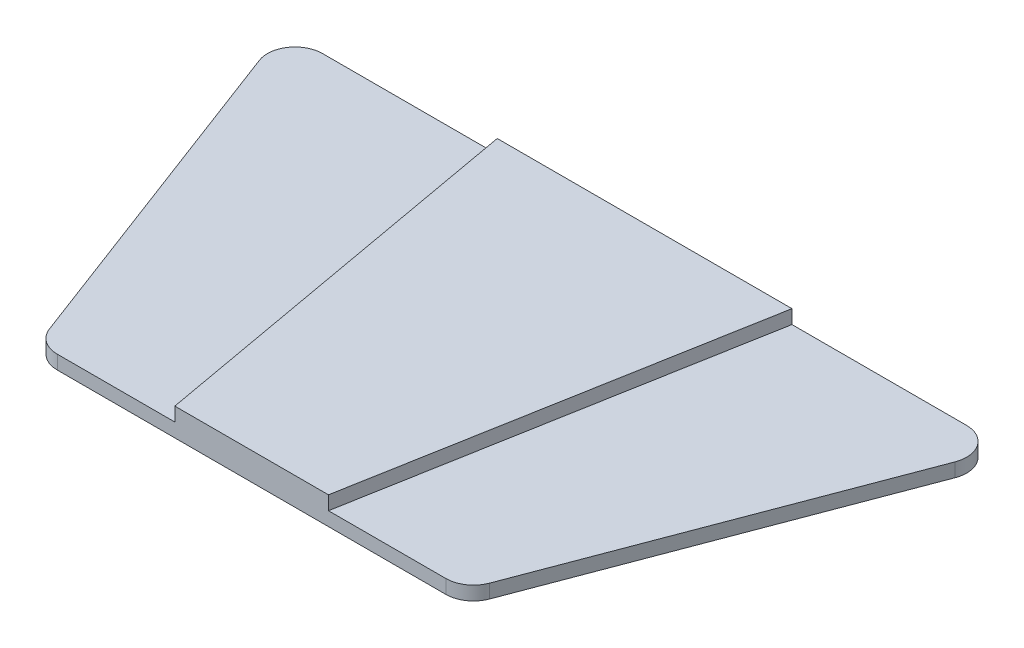
ISO-10303-21;
HEADER;
FILE_DESCRIPTION(('STEP AP214'),'2;1');
FILE_NAME('part.step','',(''),(''),'','','');
FILE_SCHEMA(('AUTOMOTIVE_DESIGN { 1 0 10303 214 1 1 1 1 }'));
ENDSEC;
DATA;
#1=APPLICATION_CONTEXT('core data for automotive mechanical design processes');
#2=APPLICATION_PROTOCOL_DEFINITION('international standard','automotive_design',2000,#1);
#3=PRODUCT_CONTEXT('',#1,'mechanical');
#4=PRODUCT('Part','Part','',(#3));
#5=PRODUCT_RELATED_PRODUCT_CATEGORY('part','',(#4));
#6=PRODUCT_DEFINITION_FORMATION('','',#4);
#7=PRODUCT_DEFINITION_CONTEXT('part definition',#1,'design');
#8=PRODUCT_DEFINITION('design','',#6,#7);
#9=PRODUCT_DEFINITION_SHAPE('','',#8);
#10=(LENGTH_UNIT() NAMED_UNIT(*) SI_UNIT(.MILLI.,.METRE.));
#11=(NAMED_UNIT(*) PLANE_ANGLE_UNIT() SI_UNIT($,.RADIAN.));
#12=(NAMED_UNIT(*) SI_UNIT($,.STERADIAN.) SOLID_ANGLE_UNIT());
#13=UNCERTAINTY_MEASURE_WITH_UNIT(LENGTH_MEASURE(1.E-05),#10,'distance_accuracy_value','');
#14=(GEOMETRIC_REPRESENTATION_CONTEXT(3) GLOBAL_UNCERTAINTY_ASSIGNED_CONTEXT((#13)) GLOBAL_UNIT_ASSIGNED_CONTEXT((#10,
#11,#12)) REPRESENTATION_CONTEXT('',''));
#15=CARTESIAN_POINT('',(0.,0.,0.));
#16=DIRECTION('',(0.,0.,1.));
#17=DIRECTION('',(1.,0.,0.));
#18=AXIS2_PLACEMENT_3D('',#15,#16,#17);
#19=CARTESIAN_POINT('',(53.4082751274246,0.,-33.1839113300493));
#20=DIRECTION('',(0.,1.,0.));
#21=DIRECTION('',(0.,0.,1.));
#22=AXIS2_PLACEMENT_3D('',#19,#20,#21);
#23=PLANE('',#22);
#24=DIRECTION('',(0.176691781155966,0.,-0.984266231500366));
#25=VECTOR('',#24,1.);
#26=CARTESIAN_POINT('',(12.7394142162478,0.,27.4162507974625));
#27=LINE('',#26,#25);
#28=CARTESIAN_POINT('',(12.7394142162478,0.,27.4162507974625));
#29=VERTEX_POINT('',#28);
#30=CARTESIAN_POINT('',(24.4388762515773,0.,-37.7559113300493));
#31=VERTEX_POINT('',#30);
#32=EDGE_CURVE('E48',#29,#31,#27,.T.);
#33=ORIENTED_EDGE('',*,*,#32,.F.);
#34=DIRECTION('',(1.,0.,0.));
#35=VECTOR('',#34,1.);
#36=CARTESIAN_POINT('',(-32.2211549951722,0.,27.4162507974625));
#37=LINE('',#36,#35);
#38=CARTESIAN_POINT('',(32.2211549951722,0.,27.4162507974625));
#39=VERTEX_POINT('',#38);
#40=EDGE_CURVE('E168',#29,#39,#37,.T.);
#41=ORIENTED_EDGE('',*,*,#40,.T.);
#42=CARTESIAN_POINT('',(32.2211549951722,0.,22.8442507974625));
#43=DIRECTION('',(0.,1.,0.));
#44=DIRECTION('',(0.,0.,-1.));
#45=AXIS2_PLACEMENT_3D('',#42,#43,#44);
#46=CIRCLE('',#45,4.572);
#47=CARTESIAN_POINT('',(36.4976051570357,0.,24.4613958166546));
#48=VERTEX_POINT('',#47);
#49=EDGE_CURVE('E187',#39,#48,#46,.T.);
#50=ORIENTED_EDGE('',*,*,#49,.T.);
#51=DIRECTION('',(0.353706259665808,0.,-0.935356553338471));
#52=VECTOR('',#51,1.);
#53=CARTESIAN_POINT('',(57.684725289288,0.,-31.5667663108572));
#54=LINE('',#53,#52);
#55=CARTESIAN_POINT('',(57.684725289288,0.,-31.5667663108572));
#56=VERTEX_POINT('',#55);
#57=EDGE_CURVE('E230',#48,#56,#54,.T.);
#58=ORIENTED_EDGE('',*,*,#57,.T.);
#59=CARTESIAN_POINT('',(53.4082751274246,0.,-33.1839113300493));
#60=DIRECTION('',(0.,1.,0.));
#61=DIRECTION('',(0.,0.,1.));
#62=AXIS2_PLACEMENT_3D('',#59,#60,#61);
#63=CIRCLE('',#62,4.572);
#64=CARTESIAN_POINT('',(53.4082751274245,0.,-37.7559113300493));
#65=VERTEX_POINT('',#64);
#66=EDGE_CURVE('E143',#56,#65,#63,.T.);
#67=ORIENTED_EDGE('',*,*,#66,.T.);
#68=DIRECTION('',(-1.,0.,0.));
#69=VECTOR('',#68,1.);
#70=CARTESIAN_POINT('',(-53.4082751274245,0.,-37.7559113300492));
#71=LINE('',#70,#69);
#72=EDGE_CURVE('E203',#65,#31,#71,.T.);
#73=ORIENTED_EDGE('',*,*,#72,.T.);
#74=EDGE_LOOP('',(#33,#41,#50,#58,#67,#73));
#75=FACE_BOUND('',#74,.T.);
#76=ADVANCED_FACE('F31',(#75),#23,.T.);
#77=CARTESIAN_POINT('',(53.4082751274246,-2.286,-33.1839113300493));
#78=DIRECTION('',(0.,1.,0.));
#79=DIRECTION('',(0.,0.,1.));
#80=AXIS2_PLACEMENT_3D('',#77,#78,#79);
#81=CYLINDRICAL_SURFACE('',#80,4.572);
#82=ORIENTED_EDGE('',*,*,#66,.F.);
#83=DIRECTION('',(0.,1.,0.));
#84=VECTOR('',#83,1.);
#85=CARTESIAN_POINT('',(57.684725289288,-2.286,-31.5667663108572));
#86=LINE('',#85,#84);
#87=CARTESIAN_POINT('',(57.684725289288,-2.286,-31.5667663108572));
#88=VERTEX_POINT('',#87);
#89=EDGE_CURVE('E11',#88,#56,#86,.T.);
#90=ORIENTED_EDGE('',*,*,#89,.F.);
#91=CARTESIAN_POINT('',(53.4082751274246,-2.286,-33.1839113300493));
#92=DIRECTION('',(0.,1.,0.));
#93=DIRECTION('',(0.,0.,1.));
#94=AXIS2_PLACEMENT_3D('',#91,#92,#93);
#95=CIRCLE('',#94,4.572);
#96=CARTESIAN_POINT('',(53.4082751274245,-2.286,-37.7559113300493));
#97=VERTEX_POINT('',#96);
#98=EDGE_CURVE('E163',#88,#97,#95,.T.);
#99=ORIENTED_EDGE('',*,*,#98,.T.);
#100=DIRECTION('',(0.,1.,0.));
#101=VECTOR('',#100,1.);
#102=CARTESIAN_POINT('',(53.4082751274245,-2.286,-37.7559113300493));
#103=LINE('',#102,#101);
#104=EDGE_CURVE('E213',#97,#65,#103,.T.);
#105=ORIENTED_EDGE('',*,*,#104,.T.);
#106=EDGE_LOOP('',(#82,#90,#99,#105));
#107=FACE_BOUND('',#106,.T.);
#108=ADVANCED_FACE('F33',(#107),#81,.T.);
#109=CARTESIAN_POINT('',(57.684725289288,-2.286,-31.5667663108572));
#110=DIRECTION('',(0.935356553338471,0.,0.353706259665808));
#111=DIRECTION('',(0.353706259665809,0.,-0.935356553338471));
#112=AXIS2_PLACEMENT_3D('',#109,#110,#111);
#113=PLANE('',#112);
#114=ORIENTED_EDGE('',*,*,#57,.F.);
#115=DIRECTION('',(0.,1.,0.));
#116=VECTOR('',#115,1.);
#117=CARTESIAN_POINT('',(36.4976051570357,-2.286,24.4613958166546));
#118=LINE('',#117,#116);
#119=CARTESIAN_POINT('',(36.4976051570357,-2.286,24.4613958166546));
#120=VERTEX_POINT('',#119);
#121=EDGE_CURVE('E40',#120,#48,#118,.T.);
#122=ORIENTED_EDGE('',*,*,#121,.F.);
#123=DIRECTION('',(0.353706259665808,0.,-0.935356553338471));
#124=VECTOR('',#123,1.);
#125=CARTESIAN_POINT('',(57.684725289288,-2.286,-31.5667663108572));
#126=LINE('',#125,#124);
#127=EDGE_CURVE('E220',#120,#88,#126,.T.);
#128=ORIENTED_EDGE('',*,*,#127,.T.);
#129=ORIENTED_EDGE('',*,*,#89,.T.);
#130=EDGE_LOOP('',(#114,#122,#128,#129));
#131=FACE_BOUND('',#130,.T.);
#132=ADVANCED_FACE('F261',(#131),#113,.T.);
#133=CARTESIAN_POINT('',(32.2211549951722,-2.286,22.8442507974625));
#134=DIRECTION('',(0.,1.,0.));
#135=DIRECTION('',(0.,0.,1.));
#136=AXIS2_PLACEMENT_3D('',#133,#134,#135);
#137=CYLINDRICAL_SURFACE('',#136,4.572);
#138=ORIENTED_EDGE('',*,*,#49,.F.);
#139=DIRECTION('',(0.,1.,0.));
#140=VECTOR('',#139,1.);
#141=CARTESIAN_POINT('',(32.2211549951722,-2.286,27.4162507974625));
#142=LINE('',#141,#140);
#143=CARTESIAN_POINT('',(32.2211549951722,-2.286,27.4162507974625));
#144=VERTEX_POINT('',#143);
#145=EDGE_CURVE('E182',#144,#39,#142,.T.);
#146=ORIENTED_EDGE('',*,*,#145,.F.);
#147=CARTESIAN_POINT('',(32.2211549951722,-2.286,22.8442507974625));
#148=DIRECTION('',(0.,1.,0.));
#149=DIRECTION('',(0.,0.,-1.));
#150=AXIS2_PLACEMENT_3D('',#147,#148,#149);
#151=CIRCLE('',#150,4.572);
#152=EDGE_CURVE('E376',#144,#120,#151,.T.);
#153=ORIENTED_EDGE('',*,*,#152,.T.);
#154=ORIENTED_EDGE('',*,*,#121,.T.);
#155=EDGE_LOOP('',(#138,#146,#153,#154));
#156=FACE_BOUND('',#155,.T.);
#157=ADVANCED_FACE('F265',(#156),#137,.T.);
#158=CARTESIAN_POINT('',(-32.2211549951722,-2.286,27.4162507974625));
#159=DIRECTION('',(0.,0.,1.));
#160=DIRECTION('',(1.,0.,0.));
#161=AXIS2_PLACEMENT_3D('',#158,#159,#160);
#162=PLANE('',#161);
#163=CARTESIAN_POINT('',(-32.2211549951722,0.,27.4162507974625));
#164=VERTEX_POINT('',#163);
#165=CARTESIAN_POINT('',(-12.7394142162478,0.,27.4162507974625));
#166=VERTEX_POINT('',#165);
#167=EDGE_CURVE('E185',#164,#166,#37,.T.);
#168=ORIENTED_EDGE('',*,*,#167,.F.);
#169=DIRECTION('',(0.,1.,0.));
#170=VECTOR('',#169,1.);
#171=CARTESIAN_POINT('',(-32.2211549951722,-2.286,27.4162507974625));
#172=LINE('',#171,#170);
#173=CARTESIAN_POINT('',(-32.2211549951722,-2.286,27.4162507974625));
#174=VERTEX_POINT('',#173);
#175=EDGE_CURVE('E235',#174,#164,#172,.T.);
#176=ORIENTED_EDGE('',*,*,#175,.F.);
#177=DIRECTION('',(1.,0.,0.));
#178=VECTOR('',#177,1.);
#179=CARTESIAN_POINT('',(-32.2211549951722,-2.286,27.4162507974625));
#180=LINE('',#179,#178);
#181=EDGE_CURVE('E373',#174,#144,#180,.T.);
#182=ORIENTED_EDGE('',*,*,#181,.T.);
#183=ORIENTED_EDGE('',*,*,#145,.T.);
#184=ORIENTED_EDGE('',*,*,#40,.F.);
#185=DIRECTION('',(0.,-1.,0.));
#186=VECTOR('',#185,1.);
#187=CARTESIAN_POINT('',(12.7394142162478,2.286,27.4162507974625));
#188=LINE('',#187,#186);
#189=CARTESIAN_POINT('',(12.7394142162478,2.286,27.4162507974625));
#190=VERTEX_POINT('',#189);
#191=EDGE_CURVE('E156',#190,#29,#188,.T.);
#192=ORIENTED_EDGE('',*,*,#191,.F.);
#193=DIRECTION('',(1.,0.,0.));
#194=VECTOR('',#193,1.);
#195=CARTESIAN_POINT('',(-12.7394142162478,2.286,27.4162507974625));
#196=LINE('',#195,#194);
#197=CARTESIAN_POINT('',(-12.7394142162478,2.286,27.4162507974625));
#198=VERTEX_POINT('',#197);
#199=EDGE_CURVE('E137',#198,#190,#196,.T.);
#200=ORIENTED_EDGE('',*,*,#199,.F.);
#201=DIRECTION('',(0.,-1.,0.));
#202=VECTOR('',#201,1.);
#203=CARTESIAN_POINT('',(-12.7394142162478,2.286,27.4162507974625));
#204=LINE('',#203,#202);
#205=EDGE_CURVE('E148',#198,#166,#204,.T.);
#206=ORIENTED_EDGE('',*,*,#205,.T.);
#207=EDGE_LOOP('',(#168,#176,#182,#183,#184,#192,#200,#206));
#208=FACE_BOUND('',#207,.T.);
#209=ADVANCED_FACE('F179',(#208),#162,.T.);
#210=CARTESIAN_POINT('',(-32.2211549951722,-2.286,22.8442507974625));
#211=DIRECTION('',(0.,1.,0.));
#212=DIRECTION('',(0.,0.,1.));
#213=AXIS2_PLACEMENT_3D('',#210,#211,#212);
#214=CYLINDRICAL_SURFACE('',#213,4.572);
#215=CARTESIAN_POINT('',(-32.2211549951722,0.,22.8442507974625));
#216=DIRECTION('',(0.,1.,0.));
#217=DIRECTION('',(0.,0.,1.));
#218=AXIS2_PLACEMENT_3D('',#215,#216,#217);
#219=CIRCLE('',#218,4.572);
#220=CARTESIAN_POINT('',(-36.4976051570357,0.,24.4613958166545));
#221=VERTEX_POINT('',#220);
#222=EDGE_CURVE('E186',#221,#164,#219,.T.);
#223=ORIENTED_EDGE('',*,*,#222,.F.);
#224=DIRECTION('',(0.,1.,0.));
#225=VECTOR('',#224,1.);
#226=CARTESIAN_POINT('',(-36.4976051570357,-2.286,24.4613958166545));
#227=LINE('',#226,#225);
#228=CARTESIAN_POINT('',(-36.4976051570357,-2.286,24.4613958166545));
#229=VERTEX_POINT('',#228);
#230=EDGE_CURVE('E237',#229,#221,#227,.T.);
#231=ORIENTED_EDGE('',*,*,#230,.F.);
#232=CARTESIAN_POINT('',(-32.2211549951722,-2.286,22.8442507974625));
#233=DIRECTION('',(0.,1.,0.));
#234=DIRECTION('',(0.,0.,1.));
#235=AXIS2_PLACEMENT_3D('',#232,#233,#234);
#236=CIRCLE('',#235,4.572);
#237=EDGE_CURVE('E371',#229,#174,#236,.T.);
#238=ORIENTED_EDGE('',*,*,#237,.T.);
#239=ORIENTED_EDGE('',*,*,#175,.T.);
#240=EDGE_LOOP('',(#223,#231,#238,#239));
#241=FACE_BOUND('',#240,.T.);
#242=ADVANCED_FACE('F275',(#241),#214,.T.);
#243=CARTESIAN_POINT('',(-57.684725289288,-2.286,-31.5667663108572));
#244=DIRECTION('',(-0.935356553338471,0.,0.353706259665809));
#245=DIRECTION('',(0.353706259665809,0.,0.935356553338471));
#246=AXIS2_PLACEMENT_3D('',#243,#244,#245);
#247=PLANE('',#246);
#248=DIRECTION('',(0.353706259665809,0.,0.935356553338471));
#249=VECTOR('',#248,1.);
#250=CARTESIAN_POINT('',(-57.684725289288,0.,-31.5667663108572));
#251=LINE('',#250,#249);
#252=CARTESIAN_POINT('',(-57.684725289288,0.,-31.5667663108572));
#253=VERTEX_POINT('',#252);
#254=EDGE_CURVE('E189',#253,#221,#251,.T.);
#255=ORIENTED_EDGE('',*,*,#254,.F.);
#256=DIRECTION('',(0.,1.,0.));
#257=VECTOR('',#256,1.);
#258=CARTESIAN_POINT('',(-57.684725289288,-2.286,-31.5667663108572));
#259=LINE('',#258,#257);
#260=CARTESIAN_POINT('',(-57.684725289288,-2.286,-31.5667663108572));
#261=VERTEX_POINT('',#260);
#262=EDGE_CURVE('E239',#261,#253,#259,.T.);
#263=ORIENTED_EDGE('',*,*,#262,.F.);
#264=DIRECTION('',(0.353706259665809,0.,0.935356553338471));
#265=VECTOR('',#264,1.);
#266=CARTESIAN_POINT('',(-57.684725289288,-2.286,-31.5667663108572));
#267=LINE('',#266,#265);
#268=EDGE_CURVE('E379',#261,#229,#267,.T.);
#269=ORIENTED_EDGE('',*,*,#268,.T.);
#270=ORIENTED_EDGE('',*,*,#230,.T.);
#271=EDGE_LOOP('',(#255,#263,#269,#270));
#272=FACE_BOUND('',#271,.T.);
#273=ADVANCED_FACE('F246',(#272),#247,.T.);
#274=CARTESIAN_POINT('',(-53.4082751274246,-2.286,-33.1839113300492));
#275=DIRECTION('',(0.,1.,0.));
#276=DIRECTION('',(0.,0.,1.));
#277=AXIS2_PLACEMENT_3D('',#274,#275,#276);
#278=CYLINDRICAL_SURFACE('',#277,4.572);
#279=CARTESIAN_POINT('',(-53.4082751274246,0.,-33.1839113300492));
#280=DIRECTION('',(0.,1.,0.));
#281=DIRECTION('',(0.,0.,-1.));
#282=AXIS2_PLACEMENT_3D('',#279,#280,#281);
#283=CIRCLE('',#282,4.572);
#284=CARTESIAN_POINT('',(-53.4082751274245,0.,-37.7559113300492));
#285=VERTEX_POINT('',#284);
#286=EDGE_CURVE('E193',#285,#253,#283,.T.);
#287=ORIENTED_EDGE('',*,*,#286,.F.);
#288=DIRECTION('',(0.,1.,0.));
#289=VECTOR('',#288,1.);
#290=CARTESIAN_POINT('',(-53.4082751274245,-2.286,-37.7559113300492));
#291=LINE('',#290,#289);
#292=CARTESIAN_POINT('',(-53.4082751274245,-2.286,-37.7559113300492));
#293=VERTEX_POINT('',#292);
#294=EDGE_CURVE('E219',#293,#285,#291,.T.);
#295=ORIENTED_EDGE('',*,*,#294,.F.);
#296=CARTESIAN_POINT('',(-53.4082751274246,-2.286,-33.1839113300492));
#297=DIRECTION('',(0.,1.,0.));
#298=DIRECTION('',(0.,0.,-1.));
#299=AXIS2_PLACEMENT_3D('',#296,#297,#298);
#300=CIRCLE('',#299,4.572);
#301=EDGE_CURVE('E229',#293,#261,#300,.T.);
#302=ORIENTED_EDGE('',*,*,#301,.T.);
#303=ORIENTED_EDGE('',*,*,#262,.T.);
#304=EDGE_LOOP('',(#287,#295,#302,#303));
#305=FACE_BOUND('',#304,.T.);
#306=ADVANCED_FACE('F242',(#305),#278,.T.);
#307=CARTESIAN_POINT('',(-53.4082751274245,-2.286,-37.7559113300492));
#308=DIRECTION('',(0.,0.,-1.));
#309=DIRECTION('',(-1.,0.,0.));
#310=AXIS2_PLACEMENT_3D('',#307,#308,#309);
#311=PLANE('',#310);
#312=ORIENTED_EDGE('',*,*,#72,.F.);
#313=ORIENTED_EDGE('',*,*,#104,.F.);
#314=DIRECTION('',(-1.,0.,0.));
#315=VECTOR('',#314,1.);
#316=CARTESIAN_POINT('',(-53.4082751274245,-2.286,-37.7559113300492));
#317=LINE('',#316,#315);
#318=EDGE_CURVE('E216',#97,#293,#317,.T.);
#319=ORIENTED_EDGE('',*,*,#318,.T.);
#320=ORIENTED_EDGE('',*,*,#294,.T.);
#321=CARTESIAN_POINT('',(-24.4388762515774,0.,-37.7559113300493));
#322=VERTEX_POINT('',#321);
#323=EDGE_CURVE('E146',#322,#285,#71,.T.);
#324=ORIENTED_EDGE('',*,*,#323,.F.);
#325=DIRECTION('',(0.,-1.,0.));
#326=VECTOR('',#325,1.);
#327=CARTESIAN_POINT('',(-24.4388762515774,2.286,-37.7559113300493));
#328=LINE('',#327,#326);
#329=CARTESIAN_POINT('',(-24.4388762515774,2.286,-37.7559113300493));
#330=VERTEX_POINT('',#329);
#331=EDGE_CURVE('E128',#330,#322,#328,.T.);
#332=ORIENTED_EDGE('',*,*,#331,.F.);
#333=DIRECTION('',(-1.,0.,0.));
#334=VECTOR('',#333,1.);
#335=CARTESIAN_POINT('',(24.4388762515774,2.286,-37.7559113300493));
#336=LINE('',#335,#334);
#337=CARTESIAN_POINT('',(24.4388762515774,2.286,-37.7559113300493));
#338=VERTEX_POINT('',#337);
#339=EDGE_CURVE('E121',#338,#330,#336,.T.);
#340=ORIENTED_EDGE('',*,*,#339,.F.);
#341=DIRECTION('',(0.,-1.,0.));
#342=VECTOR('',#341,1.);
#343=CARTESIAN_POINT('',(24.4388762515774,2.286,-37.7559113300493));
#344=LINE('',#343,#342);
#345=EDGE_CURVE('E126',#338,#31,#344,.T.);
#346=ORIENTED_EDGE('',*,*,#345,.T.);
#347=EDGE_LOOP('',(#312,#313,#319,#320,#324,#332,#340,#346));
#348=FACE_BOUND('',#347,.T.);
#349=ADVANCED_FACE('F124',(#348),#311,.T.);
#350=CARTESIAN_POINT('',(53.4082751274246,-2.286,-33.1839113300493));
#351=DIRECTION('',(0.,1.,0.));
#352=DIRECTION('',(0.,0.,1.));
#353=AXIS2_PLACEMENT_3D('',#350,#351,#352);
#354=PLANE('',#353);
#355=ORIENTED_EDGE('',*,*,#98,.F.);
#356=ORIENTED_EDGE('',*,*,#127,.F.);
#357=ORIENTED_EDGE('',*,*,#152,.F.);
#358=ORIENTED_EDGE('',*,*,#181,.F.);
#359=ORIENTED_EDGE('',*,*,#237,.F.);
#360=ORIENTED_EDGE('',*,*,#268,.F.);
#361=ORIENTED_EDGE('',*,*,#301,.F.);
#362=ORIENTED_EDGE('',*,*,#318,.F.);
#363=EDGE_LOOP('',(#355,#356,#357,#358,#359,#360,#361,#362));
#364=FACE_BOUND('',#363,.T.);
#365=ADVANCED_FACE('F224',(#364),#354,.F.);
#366=DIRECTION('',(0.176691781155966,0.,0.984266231500366));
#367=VECTOR('',#366,1.);
#368=CARTESIAN_POINT('',(-12.7394142162478,0.,27.4162507974625));
#369=LINE('',#368,#367);
#370=EDGE_CURVE('E56',#322,#166,#369,.T.);
#371=ORIENTED_EDGE('',*,*,#370,.F.);
#372=ORIENTED_EDGE('',*,*,#323,.T.);
#373=ORIENTED_EDGE('',*,*,#286,.T.);
#374=ORIENTED_EDGE('',*,*,#254,.T.);
#375=ORIENTED_EDGE('',*,*,#222,.T.);
#376=ORIENTED_EDGE('',*,*,#167,.T.);
#377=EDGE_LOOP('',(#371,#372,#373,#374,#375,#376));
#378=FACE_BOUND('',#377,.T.);
#379=ADVANCED_FACE('F247',(#378),#23,.T.);
#380=CARTESIAN_POINT('',(12.7394142162478,2.286,27.4162507974625));
#381=DIRECTION('',(-0.984266231500366,0.,-0.176691781155966));
#382=DIRECTION('',(-0.176691781155966,0.,0.984266231500366));
#383=AXIS2_PLACEMENT_3D('',#380,#381,#382);
#384=PLANE('',#383);
#385=ORIENTED_EDGE('',*,*,#32,.T.);
#386=ORIENTED_EDGE('',*,*,#345,.F.);
#387=DIRECTION('',(0.176691781155966,0.,-0.984266231500366));
#388=VECTOR('',#387,1.);
#389=CARTESIAN_POINT('',(12.7394142162478,2.286,27.4162507974625));
#390=LINE('',#389,#388);
#391=EDGE_CURVE('E132',#190,#338,#390,.T.);
#392=ORIENTED_EDGE('',*,*,#391,.F.);
#393=ORIENTED_EDGE('',*,*,#191,.T.);
#394=EDGE_LOOP('',(#385,#386,#392,#393));
#395=FACE_BOUND('',#394,.T.);
#396=ADVANCED_FACE('F142',(#395),#384,.F.);
#397=CARTESIAN_POINT('',(-12.7394142162478,2.286,27.4162507974625));
#398=DIRECTION('',(0.984266231500366,0.,-0.176691781155966));
#399=DIRECTION('',(-0.176691781155966,0.,-0.984266231500366));
#400=AXIS2_PLACEMENT_3D('',#397,#398,#399);
#401=PLANE('',#400);
#402=ORIENTED_EDGE('',*,*,#370,.T.);
#403=ORIENTED_EDGE('',*,*,#205,.F.);
#404=DIRECTION('',(0.176691781155966,0.,0.984266231500366));
#405=VECTOR('',#404,1.);
#406=CARTESIAN_POINT('',(-12.7394142162478,2.286,27.4162507974625));
#407=LINE('',#406,#405);
#408=EDGE_CURVE('E131',#330,#198,#407,.T.);
#409=ORIENTED_EDGE('',*,*,#408,.F.);
#410=ORIENTED_EDGE('',*,*,#331,.T.);
#411=EDGE_LOOP('',(#402,#403,#409,#410));
#412=FACE_BOUND('',#411,.T.);
#413=ADVANCED_FACE('F178',(#412),#401,.F.);
#414=CARTESIAN_POINT('',(24.4388762515774,2.286,-37.7559113300493));
#415=DIRECTION('',(0.,1.,0.));
#416=DIRECTION('',(0.,0.,1.));
#417=AXIS2_PLACEMENT_3D('',#414,#415,#416);
#418=PLANE('',#417);
#419=ORIENTED_EDGE('',*,*,#391,.T.);
#420=ORIENTED_EDGE('',*,*,#339,.T.);
#421=ORIENTED_EDGE('',*,*,#408,.T.);
#422=ORIENTED_EDGE('',*,*,#199,.T.);
#423=EDGE_LOOP('',(#419,#420,#421,#422));
#424=FACE_BOUND('',#423,.T.);
#425=ADVANCED_FACE('F135',(#424),#418,.T.);
#426=CLOSED_SHELL('',(#76,#108,#132,#157,#209,#242,#273,#306,#349,#365,#379,#396,#413,#425));
#427=MANIFOLD_SOLID_BREP('B2',#426);
#428=ADVANCED_BREP_SHAPE_REPRESENTATION('',(#18,#427),#14);
#429=SHAPE_DEFINITION_REPRESENTATION(#9,#428);
ENDSEC;
END-ISO-10303-21;
